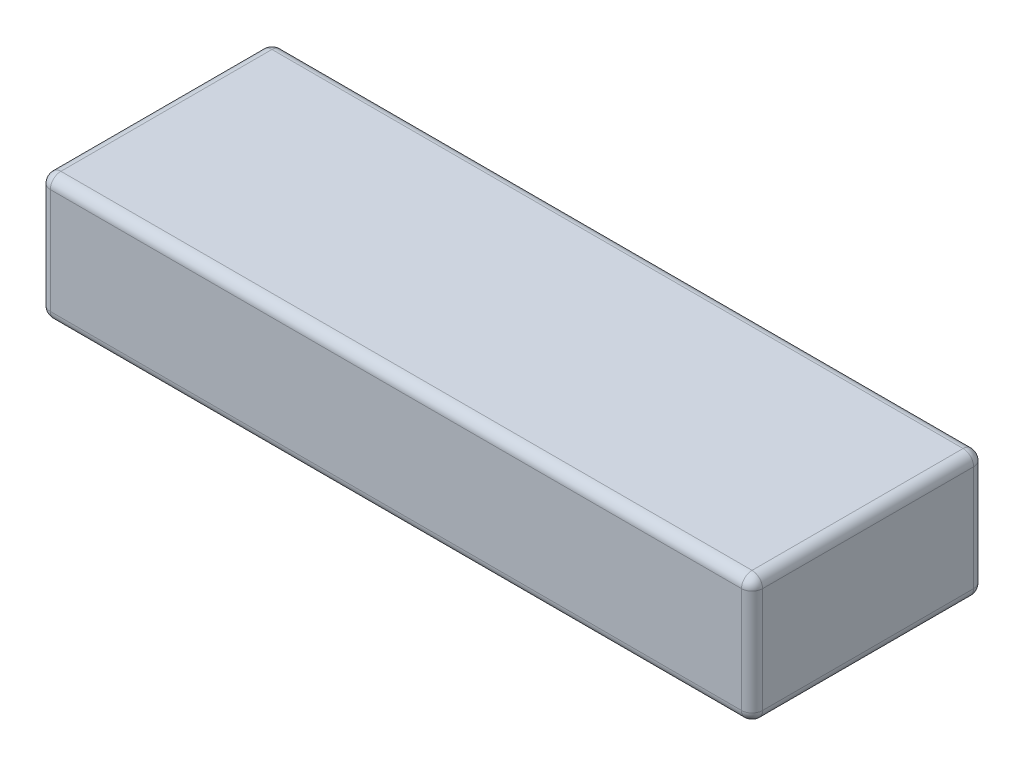
ISO-10303-21;
HEADER;
FILE_DESCRIPTION(('STEP AP214'),'2;1');
FILE_NAME('part.step','',(''),(''),'','','');
FILE_SCHEMA(('AUTOMOTIVE_DESIGN { 1 0 10303 214 1 1 1 1 }'));
ENDSEC;
DATA;
#1=APPLICATION_CONTEXT('core data for automotive mechanical design processes');
#2=APPLICATION_PROTOCOL_DEFINITION('international standard','automotive_design',2000,#1);
#3=PRODUCT_CONTEXT('',#1,'mechanical');
#4=PRODUCT('Part','Part','',(#3));
#5=PRODUCT_RELATED_PRODUCT_CATEGORY('part','',(#4));
#6=PRODUCT_DEFINITION_FORMATION('','',#4);
#7=PRODUCT_DEFINITION_CONTEXT('part definition',#1,'design');
#8=PRODUCT_DEFINITION('design','',#6,#7);
#9=PRODUCT_DEFINITION_SHAPE('','',#8);
#10=(LENGTH_UNIT() NAMED_UNIT(*) SI_UNIT(.MILLI.,.METRE.));
#11=(NAMED_UNIT(*) PLANE_ANGLE_UNIT() SI_UNIT($,.RADIAN.));
#12=(NAMED_UNIT(*) SI_UNIT($,.STERADIAN.) SOLID_ANGLE_UNIT());
#13=UNCERTAINTY_MEASURE_WITH_UNIT(LENGTH_MEASURE(1.E-05),#10,'distance_accuracy_value','');
#14=(GEOMETRIC_REPRESENTATION_CONTEXT(3) GLOBAL_UNCERTAINTY_ASSIGNED_CONTEXT((#13)) GLOBAL_UNIT_ASSIGNED_CONTEXT((#10,
#11,#12)) REPRESENTATION_CONTEXT('',''));
#15=CARTESIAN_POINT('',(0.,0.,0.));
#16=DIRECTION('',(0.,0.,1.));
#17=DIRECTION('',(1.,0.,0.));
#18=AXIS2_PLACEMENT_3D('',#15,#16,#17);
#19=CARTESIAN_POINT('',(67.5,24.,-22.));
#20=DIRECTION('',(-1.,0.,0.));
#21=DIRECTION('',(0.,0.,1.));
#22=AXIS2_PLACEMENT_3D('',#19,#20,#21);
#23=PLANE('',#22);
#24=DIRECTION('',(0.,0.,-1.));
#25=VECTOR('',#24,1.);
#26=CARTESIAN_POINT('',(67.5,2.,-22.));
#27=LINE('',#26,#25);
#28=CARTESIAN_POINT('',(67.5,2.,20.));
#29=VERTEX_POINT('',#28);
#30=CARTESIAN_POINT('',(67.5,2.,-20.));
#31=VERTEX_POINT('',#30);
#32=EDGE_CURVE('E190',#29,#31,#27,.T.);
#33=ORIENTED_EDGE('',*,*,#32,.T.);
#34=DIRECTION('',(0.,-1.,0.));
#35=VECTOR('',#34,1.);
#36=CARTESIAN_POINT('',(67.5,24.,-20.));
#37=LINE('',#36,#35);
#38=CARTESIAN_POINT('',(67.5,22.,-20.));
#39=VERTEX_POINT('',#38);
#40=EDGE_CURVE('E192',#31,#39,#37,.F.);
#41=ORIENTED_EDGE('',*,*,#40,.T.);
#42=DIRECTION('',(0.,0.,-1.));
#43=VECTOR('',#42,1.);
#44=CARTESIAN_POINT('',(67.5,22.,22.));
#45=LINE('',#44,#43);
#46=CARTESIAN_POINT('',(67.5,22.,20.));
#47=VERTEX_POINT('',#46);
#48=EDGE_CURVE('E186',#39,#47,#45,.F.);
#49=ORIENTED_EDGE('',*,*,#48,.T.);
#50=DIRECTION('',(0.,-1.,0.));
#51=VECTOR('',#50,1.);
#52=CARTESIAN_POINT('',(67.5,24.,20.));
#53=LINE('',#52,#51);
#54=EDGE_CURVE('E188',#47,#29,#53,.T.);
#55=ORIENTED_EDGE('',*,*,#54,.T.);
#56=EDGE_LOOP('',(#33,#41,#49,#55));
#57=FACE_BOUND('',#56,.T.);
#58=ADVANCED_FACE('F37',(#57),#23,.F.);
#59=CARTESIAN_POINT('',(-67.5,24.,-22.));
#60=DIRECTION('',(0.,0.,1.));
#61=DIRECTION('',(1.,0.,0.));
#62=AXIS2_PLACEMENT_3D('',#59,#60,#61);
#63=PLANE('',#62);
#64=DIRECTION('',(0.,-1.,0.));
#65=VECTOR('',#64,1.);
#66=CARTESIAN_POINT('',(-65.5,24.,-22.));
#67=LINE('',#66,#65);
#68=CARTESIAN_POINT('',(-65.5,2.,-22.));
#69=VERTEX_POINT('',#68);
#70=CARTESIAN_POINT('',(-65.5,22.,-22.));
#71=VERTEX_POINT('',#70);
#72=EDGE_CURVE('E172',#69,#71,#67,.F.);
#73=ORIENTED_EDGE('',*,*,#72,.T.);
#74=DIRECTION('',(-1.,0.,0.));
#75=VECTOR('',#74,1.);
#76=CARTESIAN_POINT('',(67.5,22.,-22.));
#77=LINE('',#76,#75);
#78=CARTESIAN_POINT('',(65.5,22.,-22.));
#79=VERTEX_POINT('',#78);
#80=EDGE_CURVE('E175',#71,#79,#77,.F.);
#81=ORIENTED_EDGE('',*,*,#80,.T.);
#82=DIRECTION('',(0.,-1.,0.));
#83=VECTOR('',#82,1.);
#84=CARTESIAN_POINT('',(65.5,24.,-22.));
#85=LINE('',#84,#83);
#86=CARTESIAN_POINT('',(65.5,2.,-22.));
#87=VERTEX_POINT('',#86);
#88=EDGE_CURVE('E170',#79,#87,#85,.T.);
#89=ORIENTED_EDGE('',*,*,#88,.T.);
#90=DIRECTION('',(-1.,0.,0.));
#91=VECTOR('',#90,1.);
#92=CARTESIAN_POINT('',(-67.5,2.,-22.));
#93=LINE('',#92,#91);
#94=EDGE_CURVE('E168',#87,#69,#93,.T.);
#95=ORIENTED_EDGE('',*,*,#94,.T.);
#96=EDGE_LOOP('',(#73,#81,#89,#95));
#97=FACE_BOUND('',#96,.T.);
#98=ADVANCED_FACE('F308',(#97),#63,.F.);
#99=CARTESIAN_POINT('',(-67.5,24.,-22.));
#100=DIRECTION('',(1.,0.,0.));
#101=DIRECTION('',(0.,0.,-1.));
#102=AXIS2_PLACEMENT_3D('',#99,#100,#101);
#103=PLANE('',#102);
#104=DIRECTION('',(0.,0.,1.));
#105=VECTOR('',#104,1.);
#106=CARTESIAN_POINT('',(-67.5,22.,-22.));
#107=LINE('',#106,#105);
#108=CARTESIAN_POINT('',(-67.5,22.,20.));
#109=VERTEX_POINT('',#108);
#110=CARTESIAN_POINT('',(-67.5,22.,-20.));
#111=VERTEX_POINT('',#110);
#112=EDGE_CURVE('E129',#109,#111,#107,.F.);
#113=ORIENTED_EDGE('',*,*,#112,.T.);
#114=DIRECTION('',(0.,-1.,0.));
#115=VECTOR('',#114,1.);
#116=CARTESIAN_POINT('',(-67.5,24.,-20.));
#117=LINE('',#116,#115);
#118=CARTESIAN_POINT('',(-67.5,2.,-20.));
#119=VERTEX_POINT('',#118);
#120=EDGE_CURVE('E166',#111,#119,#117,.T.);
#121=ORIENTED_EDGE('',*,*,#120,.T.);
#122=DIRECTION('',(0.,0.,1.));
#123=VECTOR('',#122,1.);
#124=CARTESIAN_POINT('',(-67.5,2.,-22.));
#125=LINE('',#124,#123);
#126=CARTESIAN_POINT('',(-67.5,2.,20.));
#127=VERTEX_POINT('',#126);
#128=EDGE_CURVE('E132',#119,#127,#125,.T.);
#129=ORIENTED_EDGE('',*,*,#128,.T.);
#130=DIRECTION('',(0.,-1.,0.));
#131=VECTOR('',#130,1.);
#132=CARTESIAN_POINT('',(-67.5,24.,20.));
#133=LINE('',#132,#131);
#134=EDGE_CURVE('E124',#127,#109,#133,.F.);
#135=ORIENTED_EDGE('',*,*,#134,.T.);
#136=EDGE_LOOP('',(#113,#121,#129,#135));
#137=FACE_BOUND('',#136,.T.);
#138=ADVANCED_FACE('F126',(#137),#103,.F.);
#139=CARTESIAN_POINT('',(-67.5,24.,22.));
#140=DIRECTION('',(0.,0.,-1.));
#141=DIRECTION('',(-1.,0.,0.));
#142=AXIS2_PLACEMENT_3D('',#139,#140,#141);
#143=PLANE('',#142);
#144=DIRECTION('',(0.,-1.,0.));
#145=VECTOR('',#144,1.);
#146=CARTESIAN_POINT('',(-65.5,24.,22.));
#147=LINE('',#146,#145);
#148=CARTESIAN_POINT('',(-65.5,22.,22.));
#149=VERTEX_POINT('',#148);
#150=CARTESIAN_POINT('',(-65.5,2.,22.));
#151=VERTEX_POINT('',#150);
#152=EDGE_CURVE('E143',#149,#151,#147,.T.);
#153=ORIENTED_EDGE('',*,*,#152,.T.);
#154=DIRECTION('',(1.,0.,0.));
#155=VECTOR('',#154,1.);
#156=CARTESIAN_POINT('',(-67.5,2.,22.));
#157=LINE('',#156,#155);
#158=CARTESIAN_POINT('',(65.5,2.,22.));
#159=VERTEX_POINT('',#158);
#160=EDGE_CURVE('E200',#151,#159,#157,.T.);
#161=ORIENTED_EDGE('',*,*,#160,.T.);
#162=DIRECTION('',(0.,-1.,0.));
#163=VECTOR('',#162,1.);
#164=CARTESIAN_POINT('',(65.5,24.,22.));
#165=LINE('',#164,#163);
#166=CARTESIAN_POINT('',(65.5,22.,22.));
#167=VERTEX_POINT('',#166);
#168=EDGE_CURVE('E197',#159,#167,#165,.F.);
#169=ORIENTED_EDGE('',*,*,#168,.T.);
#170=DIRECTION('',(1.,0.,0.));
#171=VECTOR('',#170,1.);
#172=CARTESIAN_POINT('',(-67.5,22.,22.));
#173=LINE('',#172,#171);
#174=EDGE_CURVE('E195',#167,#149,#173,.F.);
#175=ORIENTED_EDGE('',*,*,#174,.T.);
#176=EDGE_LOOP('',(#153,#161,#169,#175));
#177=FACE_BOUND('',#176,.T.);
#178=ADVANCED_FACE('F299',(#177),#143,.F.);
#179=CARTESIAN_POINT('',(0.,24.,0.));
#180=DIRECTION('',(0.,1.,0.));
#181=DIRECTION('',(0.,0.,1.));
#182=AXIS2_PLACEMENT_3D('',#179,#180,#181);
#183=PLANE('',#182);
#184=DIRECTION('',(0.,0.,1.));
#185=VECTOR('',#184,1.);
#186=CARTESIAN_POINT('',(-65.5,24.,22.));
#187=LINE('',#186,#185);
#188=CARTESIAN_POINT('',(-65.5,24.,-20.));
#189=VERTEX_POINT('',#188);
#190=CARTESIAN_POINT('',(-65.5,24.,20.));
#191=VERTEX_POINT('',#190);
#192=EDGE_CURVE('E46',#189,#191,#187,.T.);
#193=ORIENTED_EDGE('',*,*,#192,.T.);
#194=DIRECTION('',(1.,0.,0.));
#195=VECTOR('',#194,1.);
#196=CARTESIAN_POINT('',(67.5,24.,20.));
#197=LINE('',#196,#195);
#198=CARTESIAN_POINT('',(65.5,24.,20.));
#199=VERTEX_POINT('',#198);
#200=EDGE_CURVE('E11',#191,#199,#197,.T.);
#201=ORIENTED_EDGE('',*,*,#200,.T.);
#202=DIRECTION('',(0.,0.,-1.));
#203=VECTOR('',#202,1.);
#204=CARTESIAN_POINT('',(65.5,24.,-22.));
#205=LINE('',#204,#203);
#206=CARTESIAN_POINT('',(65.5,24.,-20.));
#207=VERTEX_POINT('',#206);
#208=EDGE_CURVE('E202',#199,#207,#205,.T.);
#209=ORIENTED_EDGE('',*,*,#208,.T.);
#210=DIRECTION('',(-1.,0.,0.));
#211=VECTOR('',#210,1.);
#212=CARTESIAN_POINT('',(-67.5,24.,-20.));
#213=LINE('',#212,#211);
#214=EDGE_CURVE('E57',#207,#189,#213,.T.);
#215=ORIENTED_EDGE('',*,*,#214,.T.);
#216=EDGE_LOOP('',(#193,#201,#209,#215));
#217=FACE_BOUND('',#216,.T.);
#218=ADVANCED_FACE('F301',(#217),#183,.T.);
#219=CARTESIAN_POINT('',(0.,0.,0.));
#220=DIRECTION('',(0.,1.,0.));
#221=DIRECTION('',(0.,0.,1.));
#222=AXIS2_PLACEMENT_3D('',#219,#220,#221);
#223=PLANE('',#222);
#224=DIRECTION('',(0.,0.,-1.));
#225=VECTOR('',#224,1.);
#226=CARTESIAN_POINT('',(65.5,0.,0.));
#227=LINE('',#226,#225);
#228=CARTESIAN_POINT('',(65.5,0.,-20.));
#229=VERTEX_POINT('',#228);
#230=CARTESIAN_POINT('',(65.5,0.,20.));
#231=VERTEX_POINT('',#230);
#232=EDGE_CURVE('E179',#229,#231,#227,.F.);
#233=ORIENTED_EDGE('',*,*,#232,.T.);
#234=DIRECTION('',(1.,0.,0.));
#235=VECTOR('',#234,1.);
#236=CARTESIAN_POINT('',(0.,0.,20.));
#237=LINE('',#236,#235);
#238=CARTESIAN_POINT('',(-65.5,0.,20.));
#239=VERTEX_POINT('',#238);
#240=EDGE_CURVE('E184',#231,#239,#237,.F.);
#241=ORIENTED_EDGE('',*,*,#240,.T.);
#242=DIRECTION('',(0.,0.,1.));
#243=VECTOR('',#242,1.);
#244=CARTESIAN_POINT('',(-65.5,0.,0.));
#245=LINE('',#244,#243);
#246=CARTESIAN_POINT('',(-65.5,0.,-20.));
#247=VERTEX_POINT('',#246);
#248=EDGE_CURVE('E181',#239,#247,#245,.F.);
#249=ORIENTED_EDGE('',*,*,#248,.T.);
#250=DIRECTION('',(-1.,0.,0.));
#251=VECTOR('',#250,1.);
#252=CARTESIAN_POINT('',(0.,0.,-20.));
#253=LINE('',#252,#251);
#254=EDGE_CURVE('E177',#247,#229,#253,.F.);
#255=ORIENTED_EDGE('',*,*,#254,.T.);
#256=EDGE_LOOP('',(#233,#241,#249,#255));
#257=FACE_BOUND('',#256,.T.);
#258=ADVANCED_FACE('F269',(#257),#223,.F.);
#259=CARTESIAN_POINT('',(65.5,24.,20.));
#260=DIRECTION('',(0.,-1.,0.));
#261=DIRECTION('',(0.,0.,-1.));
#262=AXIS2_PLACEMENT_3D('',#259,#260,#261);
#263=CYLINDRICAL_SURFACE('',#262,2.);
#264=CARTESIAN_POINT('',(65.5,22.,20.));
#265=DIRECTION('',(0.,1.,0.));
#266=DIRECTION('',(0.,0.,1.));
#267=AXIS2_PLACEMENT_3D('',#264,#265,#266);
#268=CIRCLE('',#267,2.);
#269=EDGE_CURVE('E41',#167,#47,#268,.T.);
#270=ORIENTED_EDGE('',*,*,#269,.F.);
#271=ORIENTED_EDGE('',*,*,#168,.F.);
#272=CARTESIAN_POINT('',(65.5,2.,20.));
#273=DIRECTION('',(0.,-1.,0.));
#274=DIRECTION('',(0.,0.,-1.));
#275=AXIS2_PLACEMENT_3D('',#272,#273,#274);
#276=CIRCLE('',#275,2.);
#277=EDGE_CURVE('E163',#29,#159,#276,.T.);
#278=ORIENTED_EDGE('',*,*,#277,.F.);
#279=ORIENTED_EDGE('',*,*,#54,.F.);
#280=EDGE_LOOP('',(#270,#271,#278,#279));
#281=FACE_BOUND('',#280,.T.);
#282=ADVANCED_FACE('F39',(#281),#263,.T.);
#283=CARTESIAN_POINT('',(65.5,22.,20.));
#284=DIRECTION('',(0.,0.,1.));
#285=DIRECTION('',(1.,0.,0.));
#286=AXIS2_PLACEMENT_3D('',#283,#284,#285);
#287=SPHERICAL_SURFACE('',#286,2.);
#288=CARTESIAN_POINT('',(65.5,22.,20.));
#289=DIRECTION('',(1.,0.,0.));
#290=DIRECTION('',(0.,0.,-1.));
#291=AXIS2_PLACEMENT_3D('',#288,#289,#290);
#292=CIRCLE('',#291,2.);
#293=EDGE_CURVE('E247',#167,#199,#292,.F.);
#294=ORIENTED_EDGE('',*,*,#293,.F.);
#295=ORIENTED_EDGE('',*,*,#269,.T.);
#296=CARTESIAN_POINT('',(65.5,22.,20.));
#297=DIRECTION('',(0.,0.,1.));
#298=DIRECTION('',(0.,-1.,0.));
#299=AXIS2_PLACEMENT_3D('',#296,#297,#298);
#300=CIRCLE('',#299,2.);
#301=EDGE_CURVE('E250',#199,#47,#300,.F.);
#302=ORIENTED_EDGE('',*,*,#301,.F.);
#303=EDGE_LOOP('',(#294,#295,#302));
#304=FACE_BOUND('',#303,.T.);
#305=ADVANCED_FACE('F294',(#304),#287,.T.);
#306=CARTESIAN_POINT('',(65.5,2.,20.));
#307=DIRECTION('',(0.,0.,1.));
#308=DIRECTION('',(1.,0.,0.));
#309=AXIS2_PLACEMENT_3D('',#306,#307,#308);
#310=SPHERICAL_SURFACE('',#309,2.);
#311=CARTESIAN_POINT('',(65.5,2.,20.));
#312=DIRECTION('',(0.,0.,1.));
#313=DIRECTION('',(1.,0.,0.));
#314=AXIS2_PLACEMENT_3D('',#311,#312,#313);
#315=CIRCLE('',#314,2.);
#316=EDGE_CURVE('E241',#29,#231,#315,.F.);
#317=ORIENTED_EDGE('',*,*,#316,.F.);
#318=ORIENTED_EDGE('',*,*,#277,.T.);
#319=CARTESIAN_POINT('',(65.5,2.,20.));
#320=DIRECTION('',(1.,0.,0.));
#321=DIRECTION('',(0.,0.,-1.));
#322=AXIS2_PLACEMENT_3D('',#319,#320,#321);
#323=CIRCLE('',#322,2.);
#324=EDGE_CURVE('E244',#231,#159,#323,.F.);
#325=ORIENTED_EDGE('',*,*,#324,.F.);
#326=EDGE_LOOP('',(#317,#318,#325));
#327=FACE_BOUND('',#326,.T.);
#328=ADVANCED_FACE('F257',(#327),#310,.T.);
#329=CARTESIAN_POINT('',(65.5,22.,0.));
#330=DIRECTION('',(0.,0.,1.));
#331=DIRECTION('',(1.,0.,0.));
#332=AXIS2_PLACEMENT_3D('',#329,#330,#331);
#333=CYLINDRICAL_SURFACE('',#332,2.);
#334=ORIENTED_EDGE('',*,*,#301,.T.);
#335=ORIENTED_EDGE('',*,*,#48,.F.);
#336=CARTESIAN_POINT('',(65.5,22.,-20.));
#337=DIRECTION('',(0.,0.,-1.));
#338=DIRECTION('',(-1.,0.,0.));
#339=AXIS2_PLACEMENT_3D('',#336,#337,#338);
#340=CIRCLE('',#339,2.);
#341=EDGE_CURVE('E236',#207,#39,#340,.T.);
#342=ORIENTED_EDGE('',*,*,#341,.F.);
#343=ORIENTED_EDGE('',*,*,#208,.F.);
#344=EDGE_LOOP('',(#334,#335,#342,#343));
#345=FACE_BOUND('',#344,.T.);
#346=ADVANCED_FACE('F289',(#345),#333,.T.);
#347=CARTESIAN_POINT('',(0.,22.,20.));
#348=DIRECTION('',(-1.,0.,0.));
#349=DIRECTION('',(0.,0.,1.));
#350=AXIS2_PLACEMENT_3D('',#347,#348,#349);
#351=CYLINDRICAL_SURFACE('',#350,2.);
#352=ORIENTED_EDGE('',*,*,#293,.T.);
#353=ORIENTED_EDGE('',*,*,#200,.F.);
#354=CARTESIAN_POINT('',(-65.5,22.,20.));
#355=DIRECTION('',(-1.,0.,0.));
#356=DIRECTION('',(0.,0.,1.));
#357=AXIS2_PLACEMENT_3D('',#354,#355,#356);
#358=CIRCLE('',#357,2.);
#359=EDGE_CURVE('E147',#149,#191,#358,.T.);
#360=ORIENTED_EDGE('',*,*,#359,.F.);
#361=ORIENTED_EDGE('',*,*,#174,.F.);
#362=EDGE_LOOP('',(#352,#353,#360,#361));
#363=FACE_BOUND('',#362,.T.);
#364=ADVANCED_FACE('F297',(#363),#351,.T.);
#365=CARTESIAN_POINT('',(-65.5,24.,20.));
#366=DIRECTION('',(0.,-1.,0.));
#367=DIRECTION('',(0.,0.,-1.));
#368=AXIS2_PLACEMENT_3D('',#365,#366,#367);
#369=CYLINDRICAL_SURFACE('',#368,2.);
#370=CARTESIAN_POINT('',(-65.5,2.,20.));
#371=DIRECTION('',(0.,-1.,0.));
#372=DIRECTION('',(0.,0.,-1.));
#373=AXIS2_PLACEMENT_3D('',#370,#371,#372);
#374=CIRCLE('',#373,2.);
#375=EDGE_CURVE('E148',#151,#127,#374,.T.);
#376=ORIENTED_EDGE('',*,*,#375,.F.);
#377=ORIENTED_EDGE('',*,*,#152,.F.);
#378=CARTESIAN_POINT('',(-65.5,22.,20.));
#379=DIRECTION('',(0.,1.,0.));
#380=DIRECTION('',(0.,0.,1.));
#381=AXIS2_PLACEMENT_3D('',#378,#379,#380);
#382=CIRCLE('',#381,2.);
#383=EDGE_CURVE('E139',#109,#149,#382,.T.);
#384=ORIENTED_EDGE('',*,*,#383,.F.);
#385=ORIENTED_EDGE('',*,*,#134,.F.);
#386=EDGE_LOOP('',(#376,#377,#384,#385));
#387=FACE_BOUND('',#386,.T.);
#388=ADVANCED_FACE('F141',(#387),#369,.T.);
#389=CARTESIAN_POINT('',(-67.5,2.,20.));
#390=DIRECTION('',(1.,0.,0.));
#391=DIRECTION('',(0.,0.,-1.));
#392=AXIS2_PLACEMENT_3D('',#389,#390,#391);
#393=CYLINDRICAL_SURFACE('',#392,2.);
#394=ORIENTED_EDGE('',*,*,#324,.T.);
#395=ORIENTED_EDGE('',*,*,#160,.F.);
#396=CARTESIAN_POINT('',(-65.5,2.,20.));
#397=DIRECTION('',(-1.,0.,0.));
#398=DIRECTION('',(0.,0.,1.));
#399=AXIS2_PLACEMENT_3D('',#396,#397,#398);
#400=CIRCLE('',#399,2.);
#401=EDGE_CURVE('E232',#239,#151,#400,.T.);
#402=ORIENTED_EDGE('',*,*,#401,.F.);
#403=ORIENTED_EDGE('',*,*,#240,.F.);
#404=EDGE_LOOP('',(#394,#395,#402,#403));
#405=FACE_BOUND('',#404,.T.);
#406=ADVANCED_FACE('F265',(#405),#393,.T.);
#407=CARTESIAN_POINT('',(65.5,2.,-22.));
#408=DIRECTION('',(0.,0.,-1.));
#409=DIRECTION('',(-1.,0.,0.));
#410=AXIS2_PLACEMENT_3D('',#407,#408,#409);
#411=CYLINDRICAL_SURFACE('',#410,2.);
#412=ORIENTED_EDGE('',*,*,#316,.T.);
#413=ORIENTED_EDGE('',*,*,#232,.F.);
#414=CARTESIAN_POINT('',(65.5,2.,-20.));
#415=DIRECTION('',(0.,0.,-1.));
#416=DIRECTION('',(-1.,0.,0.));
#417=AXIS2_PLACEMENT_3D('',#414,#415,#416);
#418=CIRCLE('',#417,2.);
#419=EDGE_CURVE('E229',#31,#229,#418,.T.);
#420=ORIENTED_EDGE('',*,*,#419,.F.);
#421=ORIENTED_EDGE('',*,*,#32,.F.);
#422=EDGE_LOOP('',(#412,#413,#420,#421));
#423=FACE_BOUND('',#422,.T.);
#424=ADVANCED_FACE('F275',(#423),#411,.T.);
#425=CARTESIAN_POINT('',(65.5,24.,-20.));
#426=DIRECTION('',(0.,-1.,0.));
#427=DIRECTION('',(0.,0.,-1.));
#428=AXIS2_PLACEMENT_3D('',#425,#426,#427);
#429=CYLINDRICAL_SURFACE('',#428,2.);
#430=CARTESIAN_POINT('',(65.5,22.,-20.));
#431=DIRECTION('',(0.,1.,0.));
#432=DIRECTION('',(0.,0.,1.));
#433=AXIS2_PLACEMENT_3D('',#430,#431,#432);
#434=CIRCLE('',#433,2.);
#435=EDGE_CURVE('E238',#39,#79,#434,.T.);
#436=ORIENTED_EDGE('',*,*,#435,.F.);
#437=ORIENTED_EDGE('',*,*,#40,.F.);
#438=CARTESIAN_POINT('',(65.5,2.,-20.));
#439=DIRECTION('',(0.,-1.,0.));
#440=DIRECTION('',(0.,0.,-1.));
#441=AXIS2_PLACEMENT_3D('',#438,#439,#440);
#442=CIRCLE('',#441,2.);
#443=EDGE_CURVE('E226',#87,#31,#442,.T.);
#444=ORIENTED_EDGE('',*,*,#443,.F.);
#445=ORIENTED_EDGE('',*,*,#88,.F.);
#446=EDGE_LOOP('',(#436,#437,#444,#445));
#447=FACE_BOUND('',#446,.T.);
#448=ADVANCED_FACE('F281',(#447),#429,.T.);
#449=CARTESIAN_POINT('',(65.5,22.,-20.));
#450=DIRECTION('',(0.,0.,1.));
#451=DIRECTION('',(1.,0.,0.));
#452=AXIS2_PLACEMENT_3D('',#449,#450,#451);
#453=SPHERICAL_SURFACE('',#452,2.);
#454=ORIENTED_EDGE('',*,*,#341,.T.);
#455=ORIENTED_EDGE('',*,*,#435,.T.);
#456=CARTESIAN_POINT('',(65.5,22.,-20.));
#457=DIRECTION('',(1.,0.,0.));
#458=DIRECTION('',(0.,0.,-1.));
#459=AXIS2_PLACEMENT_3D('',#456,#457,#458);
#460=CIRCLE('',#459,2.);
#461=EDGE_CURVE('E154',#207,#79,#460,.F.);
#462=ORIENTED_EDGE('',*,*,#461,.F.);
#463=EDGE_LOOP('',(#454,#455,#462));
#464=FACE_BOUND('',#463,.T.);
#465=ADVANCED_FACE('F355',(#464),#453,.T.);
#466=CARTESIAN_POINT('',(-65.5,22.,20.));
#467=DIRECTION('',(0.,0.,1.));
#468=DIRECTION('',(1.,0.,0.));
#469=AXIS2_PLACEMENT_3D('',#466,#467,#468);
#470=SPHERICAL_SURFACE('',#469,2.);
#471=ORIENTED_EDGE('',*,*,#383,.T.);
#472=ORIENTED_EDGE('',*,*,#359,.T.);
#473=CARTESIAN_POINT('',(-65.5,22.,20.));
#474=DIRECTION('',(0.,0.,1.));
#475=DIRECTION('',(1.,0.,0.));
#476=AXIS2_PLACEMENT_3D('',#473,#474,#475);
#477=CIRCLE('',#476,2.);
#478=EDGE_CURVE('E151',#109,#191,#477,.F.);
#479=ORIENTED_EDGE('',*,*,#478,.F.);
#480=EDGE_LOOP('',(#471,#472,#479));
#481=FACE_BOUND('',#480,.T.);
#482=ADVANCED_FACE('F152',(#481),#470,.T.);
#483=CARTESIAN_POINT('',(-65.5,2.,20.));
#484=DIRECTION('',(0.,0.,1.));
#485=DIRECTION('',(1.,0.,0.));
#486=AXIS2_PLACEMENT_3D('',#483,#484,#485);
#487=SPHERICAL_SURFACE('',#486,2.);
#488=ORIENTED_EDGE('',*,*,#401,.T.);
#489=ORIENTED_EDGE('',*,*,#375,.T.);
#490=CARTESIAN_POINT('',(-65.5,2.,20.));
#491=DIRECTION('',(0.,0.,1.));
#492=DIRECTION('',(1.,0.,0.));
#493=AXIS2_PLACEMENT_3D('',#490,#491,#492);
#494=CIRCLE('',#493,2.);
#495=EDGE_CURVE('E155',#239,#127,#494,.F.);
#496=ORIENTED_EDGE('',*,*,#495,.F.);
#497=EDGE_LOOP('',(#488,#489,#496));
#498=FACE_BOUND('',#497,.T.);
#499=ADVANCED_FACE('F348',(#498),#487,.T.);
#500=CARTESIAN_POINT('',(65.5,2.,-20.));
#501=DIRECTION('',(0.,0.,1.));
#502=DIRECTION('',(1.,0.,0.));
#503=AXIS2_PLACEMENT_3D('',#500,#501,#502);
#504=SPHERICAL_SURFACE('',#503,2.);
#505=ORIENTED_EDGE('',*,*,#443,.T.);
#506=ORIENTED_EDGE('',*,*,#419,.T.);
#507=CARTESIAN_POINT('',(65.5,2.,-20.));
#508=DIRECTION('',(1.,0.,0.));
#509=DIRECTION('',(0.,0.,-1.));
#510=AXIS2_PLACEMENT_3D('',#507,#508,#509);
#511=CIRCLE('',#510,2.);
#512=EDGE_CURVE('E219',#87,#229,#511,.F.);
#513=ORIENTED_EDGE('',*,*,#512,.F.);
#514=EDGE_LOOP('',(#505,#506,#513));
#515=FACE_BOUND('',#514,.T.);
#516=ADVANCED_FACE('F344',(#515),#504,.T.);
#517=CARTESIAN_POINT('',(0.,22.,-20.));
#518=DIRECTION('',(1.,0.,0.));
#519=DIRECTION('',(0.,0.,-1.));
#520=AXIS2_PLACEMENT_3D('',#517,#518,#519);
#521=CYLINDRICAL_SURFACE('',#520,2.);
#522=ORIENTED_EDGE('',*,*,#461,.T.);
#523=ORIENTED_EDGE('',*,*,#80,.F.);
#524=CARTESIAN_POINT('',(-65.5,22.,-20.));
#525=DIRECTION('',(-1.,0.,0.));
#526=DIRECTION('',(0.,0.,1.));
#527=AXIS2_PLACEMENT_3D('',#524,#525,#526);
#528=CIRCLE('',#527,2.);
#529=EDGE_CURVE('E216',#189,#71,#528,.T.);
#530=ORIENTED_EDGE('',*,*,#529,.F.);
#531=ORIENTED_EDGE('',*,*,#214,.F.);
#532=EDGE_LOOP('',(#522,#523,#530,#531));
#533=FACE_BOUND('',#532,.T.);
#534=ADVANCED_FACE('F341',(#533),#521,.T.);
#535=CARTESIAN_POINT('',(-65.5,22.,0.));
#536=DIRECTION('',(0.,0.,-1.));
#537=DIRECTION('',(-1.,0.,0.));
#538=AXIS2_PLACEMENT_3D('',#535,#536,#537);
#539=CYLINDRICAL_SURFACE('',#538,2.);
#540=ORIENTED_EDGE('',*,*,#478,.T.);
#541=ORIENTED_EDGE('',*,*,#192,.F.);
#542=CARTESIAN_POINT('',(-65.5,22.,-20.));
#543=DIRECTION('',(0.,0.,-1.));
#544=DIRECTION('',(-1.,0.,0.));
#545=AXIS2_PLACEMENT_3D('',#542,#543,#544);
#546=CIRCLE('',#545,2.);
#547=EDGE_CURVE('E159',#111,#189,#546,.T.);
#548=ORIENTED_EDGE('',*,*,#547,.F.);
#549=ORIENTED_EDGE('',*,*,#112,.F.);
#550=EDGE_LOOP('',(#540,#541,#548,#549));
#551=FACE_BOUND('',#550,.T.);
#552=ADVANCED_FACE('F157',(#551),#539,.T.);
#553=CARTESIAN_POINT('',(-65.5,2.,-22.));
#554=DIRECTION('',(0.,0.,1.));
#555=DIRECTION('',(1.,0.,0.));
#556=AXIS2_PLACEMENT_3D('',#553,#554,#555);
#557=CYLINDRICAL_SURFACE('',#556,2.);
#558=ORIENTED_EDGE('',*,*,#495,.T.);
#559=ORIENTED_EDGE('',*,*,#128,.F.);
#560=CARTESIAN_POINT('',(-65.5,2.,-20.));
#561=DIRECTION('',(0.,0.,-1.));
#562=DIRECTION('',(-1.,0.,0.));
#563=AXIS2_PLACEMENT_3D('',#560,#561,#562);
#564=CIRCLE('',#563,2.);
#565=EDGE_CURVE('E212',#247,#119,#564,.T.);
#566=ORIENTED_EDGE('',*,*,#565,.F.);
#567=ORIENTED_EDGE('',*,*,#248,.F.);
#568=EDGE_LOOP('',(#558,#559,#566,#567));
#569=FACE_BOUND('',#568,.T.);
#570=ADVANCED_FACE('F334',(#569),#557,.T.);
#571=CARTESIAN_POINT('',(-67.5,2.,-20.));
#572=DIRECTION('',(-1.,0.,0.));
#573=DIRECTION('',(0.,0.,1.));
#574=AXIS2_PLACEMENT_3D('',#571,#572,#573);
#575=CYLINDRICAL_SURFACE('',#574,2.);
#576=ORIENTED_EDGE('',*,*,#512,.T.);
#577=ORIENTED_EDGE('',*,*,#254,.F.);
#578=CARTESIAN_POINT('',(-65.5,2.,-20.));
#579=DIRECTION('',(-1.,0.,0.));
#580=DIRECTION('',(0.,0.,1.));
#581=AXIS2_PLACEMENT_3D('',#578,#579,#580);
#582=CIRCLE('',#581,2.);
#583=EDGE_CURVE('E210',#69,#247,#582,.T.);
#584=ORIENTED_EDGE('',*,*,#583,.F.);
#585=ORIENTED_EDGE('',*,*,#94,.F.);
#586=EDGE_LOOP('',(#576,#577,#584,#585));
#587=FACE_BOUND('',#586,.T.);
#588=ADVANCED_FACE('F330',(#587),#575,.T.);
#589=CARTESIAN_POINT('',(-65.5,22.,-20.));
#590=DIRECTION('',(0.,0.,1.));
#591=DIRECTION('',(1.,0.,0.));
#592=AXIS2_PLACEMENT_3D('',#589,#590,#591);
#593=SPHERICAL_SURFACE('',#592,2.);
#594=ORIENTED_EDGE('',*,*,#547,.T.);
#595=ORIENTED_EDGE('',*,*,#529,.T.);
#596=CARTESIAN_POINT('',(-65.5,22.,-20.));
#597=DIRECTION('',(0.,1.,0.));
#598=DIRECTION('',(0.,0.,1.));
#599=AXIS2_PLACEMENT_3D('',#596,#597,#598);
#600=CIRCLE('',#599,2.);
#601=EDGE_CURVE('E208',#111,#71,#600,.F.);
#602=ORIENTED_EDGE('',*,*,#601,.F.);
#603=EDGE_LOOP('',(#594,#595,#602));
#604=FACE_BOUND('',#603,.T.);
#605=ADVANCED_FACE('F326',(#604),#593,.T.);
#606=CARTESIAN_POINT('',(-65.5,2.,-20.));
#607=DIRECTION('',(0.,0.,1.));
#608=DIRECTION('',(1.,0.,0.));
#609=AXIS2_PLACEMENT_3D('',#606,#607,#608);
#610=SPHERICAL_SURFACE('',#609,2.);
#611=ORIENTED_EDGE('',*,*,#583,.T.);
#612=ORIENTED_EDGE('',*,*,#565,.T.);
#613=CARTESIAN_POINT('',(-65.5,2.,-20.));
#614=DIRECTION('',(0.,-1.,0.));
#615=DIRECTION('',(0.,0.,-1.));
#616=AXIS2_PLACEMENT_3D('',#613,#614,#615);
#617=CIRCLE('',#616,2.);
#618=EDGE_CURVE('E206',#69,#119,#617,.F.);
#619=ORIENTED_EDGE('',*,*,#618,.F.);
#620=EDGE_LOOP('',(#611,#612,#619));
#621=FACE_BOUND('',#620,.T.);
#622=ADVANCED_FACE('F322',(#621),#610,.T.);
#623=CARTESIAN_POINT('',(-65.5,24.,-20.));
#624=DIRECTION('',(0.,-1.,0.));
#625=DIRECTION('',(0.,0.,-1.));
#626=AXIS2_PLACEMENT_3D('',#623,#624,#625);
#627=CYLINDRICAL_SURFACE('',#626,2.);
#628=ORIENTED_EDGE('',*,*,#601,.T.);
#629=ORIENTED_EDGE('',*,*,#72,.F.);
#630=ORIENTED_EDGE('',*,*,#618,.T.);
#631=ORIENTED_EDGE('',*,*,#120,.F.);
#632=EDGE_LOOP('',(#628,#629,#630,#631));
#633=FACE_BOUND('',#632,.T.);
#634=ADVANCED_FACE('F319',(#633),#627,.T.);
#635=CLOSED_SHELL('',(#58,#98,#138,#178,#218,#258,#282,#305,#328,#346,#364,#388,#406,#424,#448,
#465,#482,#499,#516,#534,#552,#570,#588,#605,#622,#634));
#636=MANIFOLD_SOLID_BREP('B2',#635);
#637=ADVANCED_BREP_SHAPE_REPRESENTATION('',(#18,#636),#14);
#638=SHAPE_DEFINITION_REPRESENTATION(#9,#637);
ENDSEC;
END-ISO-10303-21;
